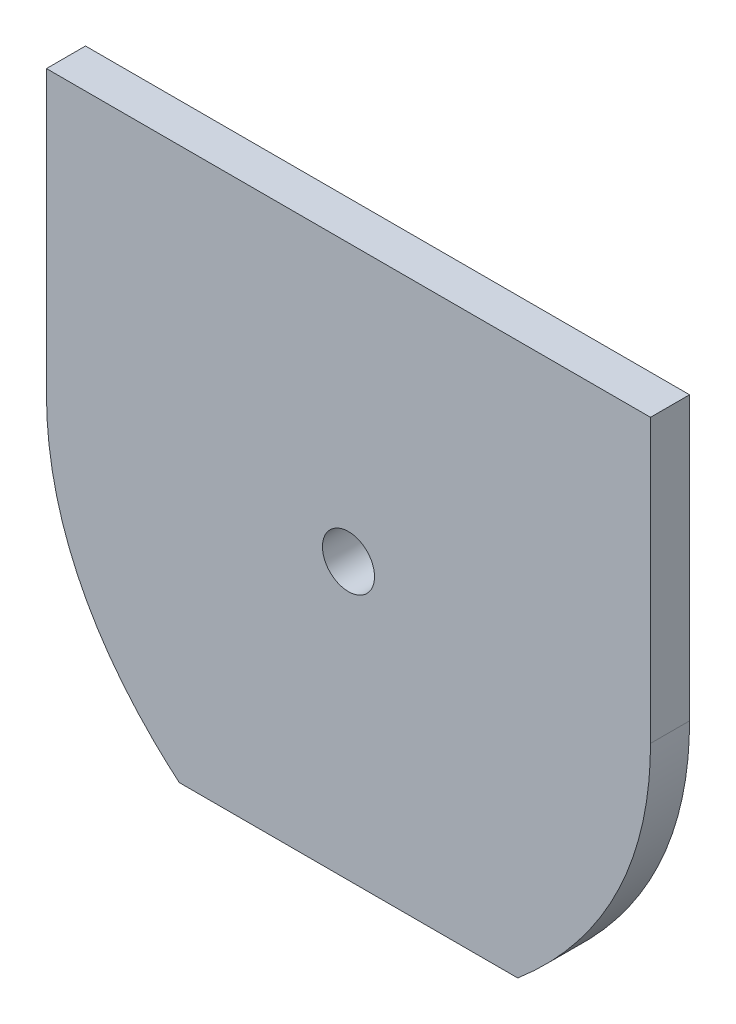
ISO-10303-21;
HEADER;
FILE_DESCRIPTION(('STEP AP214'),'2;1');
FILE_NAME('part.step','',(''),(''),'','','');
FILE_SCHEMA(('AUTOMOTIVE_DESIGN { 1 0 10303 214 1 1 1 1 }'));
ENDSEC;
DATA;
#1=APPLICATION_CONTEXT('core data for automotive mechanical design processes');
#2=APPLICATION_PROTOCOL_DEFINITION('international standard','automotive_design',2000,#1);
#3=PRODUCT_CONTEXT('',#1,'mechanical');
#4=PRODUCT('Part','Part','',(#3));
#5=PRODUCT_RELATED_PRODUCT_CATEGORY('part','',(#4));
#6=PRODUCT_DEFINITION_FORMATION('','',#4);
#7=PRODUCT_DEFINITION_CONTEXT('part definition',#1,'design');
#8=PRODUCT_DEFINITION('design','',#6,#7);
#9=PRODUCT_DEFINITION_SHAPE('','',#8);
#10=(LENGTH_UNIT() NAMED_UNIT(*) SI_UNIT(.MILLI.,.METRE.));
#11=(NAMED_UNIT(*) PLANE_ANGLE_UNIT() SI_UNIT($,.RADIAN.));
#12=(NAMED_UNIT(*) SI_UNIT($,.STERADIAN.) SOLID_ANGLE_UNIT());
#13=UNCERTAINTY_MEASURE_WITH_UNIT(LENGTH_MEASURE(1.E-05),#10,'distance_accuracy_value','');
#14=(GEOMETRIC_REPRESENTATION_CONTEXT(3) GLOBAL_UNCERTAINTY_ASSIGNED_CONTEXT((#13)) GLOBAL_UNIT_ASSIGNED_CONTEXT((#10,
#11,#12)) REPRESENTATION_CONTEXT('',''));
#15=CARTESIAN_POINT('',(0.,0.,0.));
#16=DIRECTION('',(0.,0.,1.));
#17=DIRECTION('',(1.,0.,0.));
#18=AXIS2_PLACEMENT_3D('',#15,#16,#17);
#19=CARTESIAN_POINT('',(-5.8,5.17674409854664,0.75));
#20=CARTESIAN_POINT('',(-5.8,3.03363029634734,0.75));
#21=CARTESIAN_POINT('',(-4.79511247811918,1.31139878409201,0.75));
#22=CARTESIAN_POINT('',(-3.25,0.,0.75));
#23=B_SPLINE_CURVE_WITH_KNOTS('',3,(#19,#20,#21,#22),.UNSPECIFIED.,.F.,.F.,(4,4),(0.,1.),.UNSPECIFIED.);
#24=DIRECTION('',(0.,0.,-1.));
#25=VECTOR('',#24,1.);
#26=SURFACE_OF_LINEAR_EXTRUSION('',#23,#25);
#27=CARTESIAN_POINT('',(-5.8,5.17674409854664,0.));
#28=CARTESIAN_POINT('',(-5.8,3.03363029634734,0.));
#29=CARTESIAN_POINT('',(-4.79511247811918,1.31139878409201,0.));
#30=CARTESIAN_POINT('',(-3.25,0.,0.));
#31=B_SPLINE_CURVE_WITH_KNOTS('',3,(#27,#28,#29,#30),.UNSPECIFIED.,.F.,.F.,(4,4),(0.,1.),.UNSPECIFIED.);
#32=CARTESIAN_POINT('',(-5.8,5.17674409854664,0.));
#33=VERTEX_POINT('',#32);
#34=CARTESIAN_POINT('',(-3.25,0.,0.));
#35=VERTEX_POINT('',#34);
#36=EDGE_CURVE('E118',#33,#35,#31,.T.);
#37=ORIENTED_EDGE('',*,*,#36,.T.);
#38=DIRECTION('',(0.,0.,-1.));
#39=VECTOR('',#38,1.);
#40=CARTESIAN_POINT('',(-3.25,0.,0.75));
#41=LINE('',#40,#39);
#42=CARTESIAN_POINT('',(-3.25,0.,0.75));
#43=VERTEX_POINT('',#42);
#44=EDGE_CURVE('E11',#43,#35,#41,.T.);
#45=ORIENTED_EDGE('',*,*,#44,.F.);
#46=CARTESIAN_POINT('',(-5.8,5.17674409854664,0.75));
#47=VERTEX_POINT('',#46);
#48=EDGE_CURVE('E139',#47,#43,#23,.T.);
#49=ORIENTED_EDGE('',*,*,#48,.F.);
#50=DIRECTION('',(0.,0.,-1.));
#51=VECTOR('',#50,1.);
#52=CARTESIAN_POINT('',(-5.8,5.17674409854664,0.75));
#53=LINE('',#52,#51);
#54=EDGE_CURVE('E114',#47,#33,#53,.T.);
#55=ORIENTED_EDGE('',*,*,#54,.T.);
#56=EDGE_LOOP('',(#37,#45,#49,#55));
#57=FACE_BOUND('',#56,.T.);
#58=ADVANCED_FACE('F33',(#57),#26,.F.);
#59=CARTESIAN_POINT('',(-3.25,0.,0.75));
#60=DIRECTION('',(0.,1.,0.));
#61=DIRECTION('',(0.,0.,1.));
#62=AXIS2_PLACEMENT_3D('',#59,#60,#61);
#63=PLANE('',#62);
#64=DIRECTION('',(1.,0.,0.));
#65=VECTOR('',#64,1.);
#66=CARTESIAN_POINT('',(-3.25,0.,0.));
#67=LINE('',#66,#65);
#68=CARTESIAN_POINT('',(3.25,0.,0.));
#69=VERTEX_POINT('',#68);
#70=EDGE_CURVE('E123',#35,#69,#67,.T.);
#71=ORIENTED_EDGE('',*,*,#70,.T.);
#72=DIRECTION('',(0.,0.,-1.));
#73=VECTOR('',#72,1.);
#74=CARTESIAN_POINT('',(3.25,0.,0.75));
#75=LINE('',#74,#73);
#76=CARTESIAN_POINT('',(3.25,0.,0.75));
#77=VERTEX_POINT('',#76);
#78=EDGE_CURVE('E42',#77,#69,#75,.T.);
#79=ORIENTED_EDGE('',*,*,#78,.F.);
#80=DIRECTION('',(1.,0.,0.));
#81=VECTOR('',#80,1.);
#82=CARTESIAN_POINT('',(-3.25,0.,0.75));
#83=LINE('',#82,#81);
#84=EDGE_CURVE('E87',#43,#77,#83,.T.);
#85=ORIENTED_EDGE('',*,*,#84,.F.);
#86=ORIENTED_EDGE('',*,*,#44,.T.);
#87=EDGE_LOOP('',(#71,#79,#85,#86));
#88=FACE_BOUND('',#87,.T.);
#89=ADVANCED_FACE('F165',(#88),#63,.F.);
#90=CARTESIAN_POINT('',(3.25,0.,0.75));
#91=CARTESIAN_POINT('',(4.79511247811918,1.31139878409201,0.75));
#92=CARTESIAN_POINT('',(5.8,3.03363029634734,0.75));
#93=CARTESIAN_POINT('',(5.8,5.17674409854664,0.75));
#94=B_SPLINE_CURVE_WITH_KNOTS('',3,(#90,#91,#92,#93),.UNSPECIFIED.,.F.,.F.,(4,4),(0.,1.),.UNSPECIFIED.);
#95=DIRECTION('',(0.,0.,-1.));
#96=VECTOR('',#95,1.);
#97=SURFACE_OF_LINEAR_EXTRUSION('',#94,#96);
#98=CARTESIAN_POINT('',(3.25,0.,0.));
#99=CARTESIAN_POINT('',(4.79511247811918,1.31139878409201,0.));
#100=CARTESIAN_POINT('',(5.8,3.03363029634734,0.));
#101=CARTESIAN_POINT('',(5.8,5.17674409854664,0.));
#102=B_SPLINE_CURVE_WITH_KNOTS('',3,(#98,#99,#100,#101),.UNSPECIFIED.,.F.,.F.,(4,4),(0.,1.),.UNSPECIFIED.);
#103=CARTESIAN_POINT('',(5.8,5.17674409854664,0.));
#104=VERTEX_POINT('',#103);
#105=EDGE_CURVE('E129',#69,#104,#102,.T.);
#106=ORIENTED_EDGE('',*,*,#105,.T.);
#107=DIRECTION('',(0.,0.,-1.));
#108=VECTOR('',#107,1.);
#109=CARTESIAN_POINT('',(5.8,5.17674409854664,0.75));
#110=LINE('',#109,#108);
#111=CARTESIAN_POINT('',(5.8,5.17674409854664,0.75));
#112=VERTEX_POINT('',#111);
#113=EDGE_CURVE('E109',#112,#104,#110,.T.);
#114=ORIENTED_EDGE('',*,*,#113,.F.);
#115=EDGE_CURVE('E100',#77,#112,#94,.T.);
#116=ORIENTED_EDGE('',*,*,#115,.F.);
#117=ORIENTED_EDGE('',*,*,#78,.T.);
#118=EDGE_LOOP('',(#106,#114,#116,#117));
#119=FACE_BOUND('',#118,.T.);
#120=ADVANCED_FACE('F145',(#119),#97,.F.);
#121=CARTESIAN_POINT('',(5.8,10.6,0.75));
#122=DIRECTION('',(-1.,0.,0.));
#123=DIRECTION('',(0.,0.,1.));
#124=AXIS2_PLACEMENT_3D('',#121,#122,#123);
#125=PLANE('',#124);
#126=DIRECTION('',(0.,1.,0.));
#127=VECTOR('',#126,1.);
#128=CARTESIAN_POINT('',(5.8,10.6,0.));
#129=LINE('',#128,#127);
#130=CARTESIAN_POINT('',(5.8,10.6,0.));
#131=VERTEX_POINT('',#130);
#132=EDGE_CURVE('E108',#104,#131,#129,.T.);
#133=ORIENTED_EDGE('',*,*,#132,.T.);
#134=DIRECTION('',(0.,0.,-1.));
#135=VECTOR('',#134,1.);
#136=CARTESIAN_POINT('',(5.8,10.6,0.75));
#137=LINE('',#136,#135);
#138=CARTESIAN_POINT('',(5.8,10.6,0.75));
#139=VERTEX_POINT('',#138);
#140=EDGE_CURVE('E105',#139,#131,#137,.T.);
#141=ORIENTED_EDGE('',*,*,#140,.F.);
#142=DIRECTION('',(0.,1.,0.));
#143=VECTOR('',#142,1.);
#144=CARTESIAN_POINT('',(5.8,10.6,0.75));
#145=LINE('',#144,#143);
#146=EDGE_CURVE('E94',#112,#139,#145,.T.);
#147=ORIENTED_EDGE('',*,*,#146,.F.);
#148=ORIENTED_EDGE('',*,*,#113,.T.);
#149=EDGE_LOOP('',(#133,#141,#147,#148));
#150=FACE_BOUND('',#149,.T.);
#151=ADVANCED_FACE('F106',(#150),#125,.F.);
#152=CARTESIAN_POINT('',(-5.8,10.6,0.75));
#153=DIRECTION('',(0.,-1.,0.));
#154=DIRECTION('',(0.,0.,-1.));
#155=AXIS2_PLACEMENT_3D('',#152,#153,#154);
#156=PLANE('',#155);
#157=DIRECTION('',(-1.,0.,0.));
#158=VECTOR('',#157,1.);
#159=CARTESIAN_POINT('',(-5.8,10.6,0.));
#160=LINE('',#159,#158);
#161=CARTESIAN_POINT('',(-5.8,10.6,0.));
#162=VERTEX_POINT('',#161);
#163=EDGE_CURVE('E73',#131,#162,#160,.T.);
#164=ORIENTED_EDGE('',*,*,#163,.T.);
#165=DIRECTION('',(0.,0.,-1.));
#166=VECTOR('',#165,1.);
#167=CARTESIAN_POINT('',(-5.8,10.6,0.75));
#168=LINE('',#167,#166);
#169=CARTESIAN_POINT('',(-5.8,10.6,0.75));
#170=VERTEX_POINT('',#169);
#171=EDGE_CURVE('E110',#170,#162,#168,.T.);
#172=ORIENTED_EDGE('',*,*,#171,.F.);
#173=DIRECTION('',(-1.,0.,0.));
#174=VECTOR('',#173,1.);
#175=CARTESIAN_POINT('',(-5.8,10.6,0.75));
#176=LINE('',#175,#174);
#177=EDGE_CURVE('E98',#139,#170,#176,.T.);
#178=ORIENTED_EDGE('',*,*,#177,.F.);
#179=ORIENTED_EDGE('',*,*,#140,.T.);
#180=EDGE_LOOP('',(#164,#172,#178,#179));
#181=FACE_BOUND('',#180,.T.);
#182=ADVANCED_FACE('F112',(#181),#156,.F.);
#183=CARTESIAN_POINT('',(-5.8,10.6,0.75));
#184=DIRECTION('',(1.,0.,0.));
#185=DIRECTION('',(0.,0.,-1.));
#186=AXIS2_PLACEMENT_3D('',#183,#184,#185);
#187=PLANE('',#186);
#188=DIRECTION('',(0.,-1.,0.));
#189=VECTOR('',#188,1.);
#190=CARTESIAN_POINT('',(-5.8,10.6,0.));
#191=LINE('',#190,#189);
#192=EDGE_CURVE('E79',#162,#33,#191,.T.);
#193=ORIENTED_EDGE('',*,*,#192,.T.);
#194=ORIENTED_EDGE('',*,*,#54,.F.);
#195=DIRECTION('',(0.,-1.,0.));
#196=VECTOR('',#195,1.);
#197=CARTESIAN_POINT('',(-5.8,10.6,0.75));
#198=LINE('',#197,#196);
#199=EDGE_CURVE('E50',#170,#47,#198,.T.);
#200=ORIENTED_EDGE('',*,*,#199,.F.);
#201=ORIENTED_EDGE('',*,*,#171,.T.);
#202=EDGE_LOOP('',(#193,#194,#200,#201));
#203=FACE_BOUND('',#202,.T.);
#204=ADVANCED_FACE('F152',(#203),#187,.F.);
#205=CARTESIAN_POINT('',(-5.10441717929469,2.27647891748309,0.75));
#206=DIRECTION('',(0.,0.,-1.));
#207=DIRECTION('',(-1.,0.,0.));
#208=AXIS2_PLACEMENT_3D('',#205,#206,#207);
#209=PLANE('',#208);
#210=CARTESIAN_POINT('',(0.,5.3,0.75));
#211=DIRECTION('',(0.,0.,1.));
#212=DIRECTION('',(1.,0.,0.));
#213=AXIS2_PLACEMENT_3D('',#210,#211,#212);
#214=CIRCLE('',#213,0.5);
#215=CARTESIAN_POINT('',(0.5,5.3,0.75));
#216=VERTEX_POINT('',#215);
#217=EDGE_CURVE('E124',#216,#216,#214,.T.);
#218=ORIENTED_EDGE('',*,*,#217,.F.);
#219=EDGE_LOOP('',(#218));
#220=FACE_BOUND('',#219,.T.);
#221=ORIENTED_EDGE('',*,*,#48,.T.);
#222=ORIENTED_EDGE('',*,*,#84,.T.);
#223=ORIENTED_EDGE('',*,*,#115,.T.);
#224=ORIENTED_EDGE('',*,*,#146,.T.);
#225=ORIENTED_EDGE('',*,*,#177,.T.);
#226=ORIENTED_EDGE('',*,*,#199,.T.);
#227=EDGE_LOOP('',(#221,#222,#223,#224,#225,#226));
#228=FACE_BOUND('',#227,.T.);
#229=ADVANCED_FACE('F96',(#220,#228),#209,.F.);
#230=CARTESIAN_POINT('',(-5.10441717929469,2.27647891748309,0.));
#231=DIRECTION('',(0.,0.,-1.));
#232=DIRECTION('',(-1.,0.,0.));
#233=AXIS2_PLACEMENT_3D('',#230,#231,#232);
#234=PLANE('',#233);
#235=CARTESIAN_POINT('',(0.,5.3,0.));
#236=DIRECTION('',(0.,0.,-1.));
#237=DIRECTION('',(-1.,0.,0.));
#238=AXIS2_PLACEMENT_3D('',#235,#236,#237);
#239=CIRCLE('',#238,0.5);
#240=CARTESIAN_POINT('',(-0.5,5.3,0.));
#241=VERTEX_POINT('',#240);
#242=EDGE_CURVE('E185',#241,#241,#239,.F.);
#243=ORIENTED_EDGE('',*,*,#242,.T.);
#244=EDGE_LOOP('',(#243));
#245=FACE_BOUND('',#244,.T.);
#246=ORIENTED_EDGE('',*,*,#36,.F.);
#247=ORIENTED_EDGE('',*,*,#192,.F.);
#248=ORIENTED_EDGE('',*,*,#163,.F.);
#249=ORIENTED_EDGE('',*,*,#132,.F.);
#250=ORIENTED_EDGE('',*,*,#105,.F.);
#251=ORIENTED_EDGE('',*,*,#70,.F.);
#252=EDGE_LOOP('',(#246,#247,#248,#249,#250,#251));
#253=FACE_BOUND('',#252,.T.);
#254=ADVANCED_FACE('F148',(#245,#253),#234,.T.);
#255=CARTESIAN_POINT('',(0.,5.3,-0.00100000000000002));
#256=DIRECTION('',(0.,0.,1.));
#257=DIRECTION('',(1.,0.,0.));
#258=AXIS2_PLACEMENT_3D('',#255,#256,#257);
#259=CYLINDRICAL_SURFACE('',#258,0.5);
#260=ORIENTED_EDGE('',*,*,#242,.F.);
#261=EDGE_LOOP('',(#260));
#262=FACE_BOUND('',#261,.T.);
#263=ORIENTED_EDGE('',*,*,#217,.T.);
#264=EDGE_LOOP('',(#263));
#265=FACE_BOUND('',#264,.T.);
#266=ADVANCED_FACE('F194',(#262,#265),#259,.F.);
#267=CLOSED_SHELL('',(#58,#89,#120,#151,#182,#204,#229,#254,#266));
#268=MANIFOLD_SOLID_BREP('B2',#267);
#269=ADVANCED_BREP_SHAPE_REPRESENTATION('',(#18,#268),#14);
#270=SHAPE_DEFINITION_REPRESENTATION(#9,#269);
ENDSEC;
END-ISO-10303-21;
